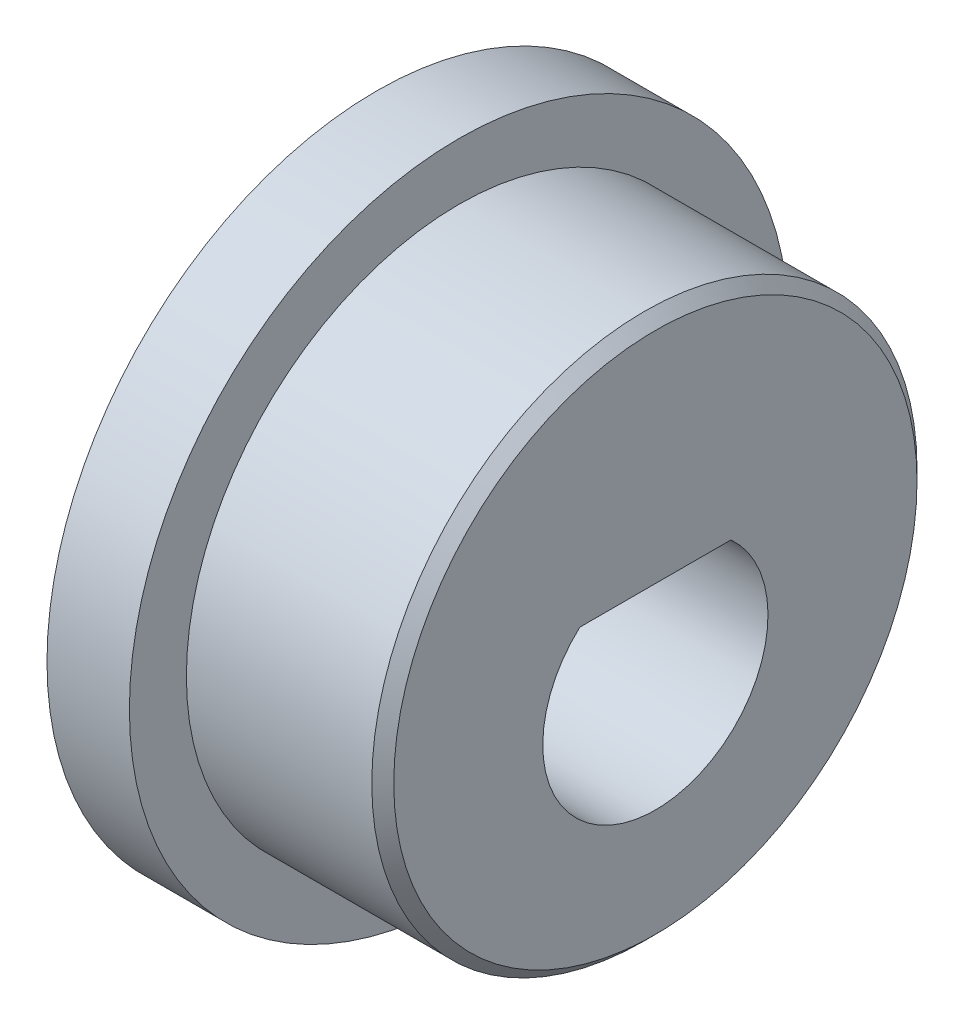
ISO-10303-21;
HEADER;
FILE_DESCRIPTION(('STEP AP214'),'2;1');
FILE_NAME('part.step','',(''),(''),'','','');
FILE_SCHEMA(('AUTOMOTIVE_DESIGN { 1 0 10303 214 1 1 1 1 }'));
ENDSEC;
DATA;
#1=APPLICATION_CONTEXT('core data for automotive mechanical design processes');
#2=APPLICATION_PROTOCOL_DEFINITION('international standard','automotive_design',2000,#1);
#3=PRODUCT_CONTEXT('',#1,'mechanical');
#4=PRODUCT('Part','Part','',(#3));
#5=PRODUCT_RELATED_PRODUCT_CATEGORY('part','',(#4));
#6=PRODUCT_DEFINITION_FORMATION('','',#4);
#7=PRODUCT_DEFINITION_CONTEXT('part definition',#1,'design');
#8=PRODUCT_DEFINITION('design','',#6,#7);
#9=PRODUCT_DEFINITION_SHAPE('','',#8);
#10=(LENGTH_UNIT() NAMED_UNIT(*) SI_UNIT(.MILLI.,.METRE.));
#11=(NAMED_UNIT(*) PLANE_ANGLE_UNIT() SI_UNIT($,.RADIAN.));
#12=(NAMED_UNIT(*) SI_UNIT($,.STERADIAN.) SOLID_ANGLE_UNIT());
#13=UNCERTAINTY_MEASURE_WITH_UNIT(LENGTH_MEASURE(1.E-05),#10,'distance_accuracy_value','');
#14=(GEOMETRIC_REPRESENTATION_CONTEXT(3) GLOBAL_UNCERTAINTY_ASSIGNED_CONTEXT((#13)) GLOBAL_UNIT_ASSIGNED_CONTEXT((#10,
#11,#12)) REPRESENTATION_CONTEXT('',''));
#15=CARTESIAN_POINT('',(0.,0.,0.));
#16=DIRECTION('',(0.,0.,1.));
#17=DIRECTION('',(1.,0.,0.));
#18=AXIS2_PLACEMENT_3D('',#15,#16,#17);
#19=CARTESIAN_POINT('',(7.15,1.5,0.));
#20=DIRECTION('',(-1.,0.,0.));
#21=DIRECTION('',(0.,0.,1.));
#22=AXIS2_PLACEMENT_3D('',#19,#20,#21);
#23=CYLINDRICAL_SURFACE('',#22,9.925);
#24=CARTESIAN_POINT('',(6.74999999999998,1.5,0.));
#25=DIRECTION('',(1.,0.,0.));
#26=DIRECTION('',(0.,0.,-1.));
#27=AXIS2_PLACEMENT_3D('',#24,#25,#26);
#28=CIRCLE('',#27,9.925);
#29=CARTESIAN_POINT('',(6.74999999999998,1.5,-9.925));
#30=VERTEX_POINT('',#29);
#31=EDGE_CURVE('E11',#30,#30,#28,.F.);
#32=ORIENTED_EDGE('',*,*,#31,.T.);
#33=EDGE_LOOP('',(#32));
#34=FACE_BOUND('',#33,.T.);
#35=CARTESIAN_POINT('',(0.,1.5,0.));
#36=DIRECTION('',(1.,0.,0.));
#37=DIRECTION('',(0.,0.,-1.));
#38=AXIS2_PLACEMENT_3D('',#35,#36,#37);
#39=CIRCLE('',#38,9.925);
#40=CARTESIAN_POINT('',(0.,1.5,-9.925));
#41=VERTEX_POINT('',#40);
#42=EDGE_CURVE('E93',#41,#41,#39,.T.);
#43=ORIENTED_EDGE('',*,*,#42,.T.);
#44=EDGE_LOOP('',(#43));
#45=FACE_BOUND('',#44,.T.);
#46=ADVANCED_FACE('F43',(#34,#45),#23,.T.);
#47=CARTESIAN_POINT('',(7.15,1.5,0.));
#48=DIRECTION('',(1.,0.,0.));
#49=DIRECTION('',(0.,0.,-1.));
#50=AXIS2_PLACEMENT_3D('',#47,#48,#49);
#51=PLANE('',#50);
#52=CARTESIAN_POINT('',(7.15,1.5,0.));
#53=DIRECTION('',(1.,0.,0.));
#54=DIRECTION('',(0.,0.,-1.));
#55=AXIS2_PLACEMENT_3D('',#52,#53,#54);
#56=CIRCLE('',#55,9.52499999999999);
#57=CARTESIAN_POINT('',(7.15,1.5,-9.52499999999999));
#58=VERTEX_POINT('',#57);
#59=EDGE_CURVE('E55',#58,#58,#56,.T.);
#60=ORIENTED_EDGE('',*,*,#59,.T.);
#61=EDGE_LOOP('',(#60));
#62=FACE_BOUND('',#61,.T.);
#63=CARTESIAN_POINT('',(7.15,0.,0.));
#64=DIRECTION('',(1.,0.,0.));
#65=DIRECTION('',(0.,0.,-1.));
#66=AXIS2_PLACEMENT_3D('',#63,#64,#65);
#67=CIRCLE('',#66,4.1);
#68=CARTESIAN_POINT('',(7.15,3.04097023990699,2.75));
#69=VERTEX_POINT('',#68);
#70=CARTESIAN_POINT('',(7.15,3.04097023990699,-2.75));
#71=VERTEX_POINT('',#70);
#72=EDGE_CURVE('E71',#69,#71,#67,.T.);
#73=ORIENTED_EDGE('',*,*,#72,.F.);
#74=DIRECTION('',(0.,0.,1.));
#75=VECTOR('',#74,1.);
#76=CARTESIAN_POINT('',(7.15,3.04097023990699,2.75));
#77=LINE('',#76,#75);
#78=EDGE_CURVE('E87',#71,#69,#77,.T.);
#79=ORIENTED_EDGE('',*,*,#78,.F.);
#80=EDGE_LOOP('',(#73,#79));
#81=FACE_BOUND('',#80,.T.);
#82=ADVANCED_FACE('F101',(#62,#81),#51,.T.);
#83=CARTESIAN_POINT('',(-3.,1.5,0.));
#84=DIRECTION('',(1.,0.,0.));
#85=DIRECTION('',(0.,0.,-1.));
#86=AXIS2_PLACEMENT_3D('',#83,#84,#85);
#87=CYLINDRICAL_SURFACE('',#86,12.);
#88=CARTESIAN_POINT('',(-3.,1.5,0.));
#89=DIRECTION('',(-1.,0.,0.));
#90=DIRECTION('',(0.,0.,1.));
#91=AXIS2_PLACEMENT_3D('',#88,#89,#90);
#92=CIRCLE('',#91,12.);
#93=CARTESIAN_POINT('',(-3.,1.5,12.));
#94=VERTEX_POINT('',#93);
#95=EDGE_CURVE('E86',#94,#94,#92,.T.);
#96=ORIENTED_EDGE('',*,*,#95,.F.);
#97=EDGE_LOOP('',(#96));
#98=FACE_BOUND('',#97,.T.);
#99=CARTESIAN_POINT('',(0.,1.5,0.));
#100=DIRECTION('',(-1.,0.,0.));
#101=DIRECTION('',(0.,0.,1.));
#102=AXIS2_PLACEMENT_3D('',#99,#100,#101);
#103=CIRCLE('',#102,12.);
#104=CARTESIAN_POINT('',(0.,1.5,12.));
#105=VERTEX_POINT('',#104);
#106=EDGE_CURVE('E95',#105,#105,#103,.T.);
#107=ORIENTED_EDGE('',*,*,#106,.T.);
#108=EDGE_LOOP('',(#107));
#109=FACE_BOUND('',#108,.T.);
#110=ADVANCED_FACE('F117',(#98,#109),#87,.T.);
#111=CARTESIAN_POINT('',(-3.,1.5,0.));
#112=DIRECTION('',(-1.,0.,0.));
#113=DIRECTION('',(0.,0.,1.));
#114=AXIS2_PLACEMENT_3D('',#111,#112,#113);
#115=PLANE('',#114);
#116=CARTESIAN_POINT('',(-3.,0.,0.));
#117=DIRECTION('',(1.,0.,0.));
#118=DIRECTION('',(0.,0.,-1.));
#119=AXIS2_PLACEMENT_3D('',#116,#117,#118);
#120=CIRCLE('',#119,4.1);
#121=CARTESIAN_POINT('',(-3.,3.04097023990699,2.75));
#122=VERTEX_POINT('',#121);
#123=CARTESIAN_POINT('',(-3.,3.04097023990699,-2.75));
#124=VERTEX_POINT('',#123);
#125=EDGE_CURVE('E70',#122,#124,#120,.T.);
#126=ORIENTED_EDGE('',*,*,#125,.T.);
#127=DIRECTION('',(0.,0.,1.));
#128=VECTOR('',#127,1.);
#129=CARTESIAN_POINT('',(-3.,3.04097023990699,2.75));
#130=LINE('',#129,#128);
#131=EDGE_CURVE('E77',#124,#122,#130,.T.);
#132=ORIENTED_EDGE('',*,*,#131,.T.);
#133=EDGE_LOOP('',(#126,#132));
#134=FACE_BOUND('',#133,.T.);
#135=ORIENTED_EDGE('',*,*,#95,.T.);
#136=EDGE_LOOP('',(#135));
#137=FACE_BOUND('',#136,.T.);
#138=ADVANCED_FACE('F85',(#134,#137),#115,.T.);
#139=CARTESIAN_POINT('',(0.,1.5,0.));
#140=DIRECTION('',(-1.,0.,0.));
#141=DIRECTION('',(0.,0.,1.));
#142=AXIS2_PLACEMENT_3D('',#139,#140,#141);
#143=PLANE('',#142);
#144=ORIENTED_EDGE('',*,*,#42,.F.);
#145=EDGE_LOOP('',(#144));
#146=FACE_BOUND('',#145,.T.);
#147=ORIENTED_EDGE('',*,*,#106,.F.);
#148=EDGE_LOOP('',(#147));
#149=FACE_BOUND('',#148,.T.);
#150=ADVANCED_FACE('F124',(#146,#149),#143,.F.);
#151=CARTESIAN_POINT('',(-3.,0.,0.));
#152=DIRECTION('',(1.,0.,0.));
#153=DIRECTION('',(0.,0.,-1.));
#154=AXIS2_PLACEMENT_3D('',#151,#152,#153);
#155=CYLINDRICAL_SURFACE('',#154,4.1);
#156=ORIENTED_EDGE('',*,*,#72,.T.);
#157=DIRECTION('',(1.,0.,0.));
#158=VECTOR('',#157,1.);
#159=CARTESIAN_POINT('',(-3.,3.04097023990699,-2.75));
#160=LINE('',#159,#158);
#161=EDGE_CURVE('E56',#124,#71,#160,.T.);
#162=ORIENTED_EDGE('',*,*,#161,.F.);
#163=ORIENTED_EDGE('',*,*,#125,.F.);
#164=DIRECTION('',(1.,0.,0.));
#165=VECTOR('',#164,1.);
#166=CARTESIAN_POINT('',(-3.,3.04097023990699,2.75));
#167=LINE('',#166,#165);
#168=EDGE_CURVE('E73',#122,#69,#167,.T.);
#169=ORIENTED_EDGE('',*,*,#168,.T.);
#170=EDGE_LOOP('',(#156,#162,#163,#169));
#171=FACE_BOUND('',#170,.T.);
#172=ADVANCED_FACE('F72',(#171),#155,.F.);
#173=CARTESIAN_POINT('',(-3.,3.04097023990699,2.75));
#174=DIRECTION('',(0.,1.,0.));
#175=DIRECTION('',(0.,0.,1.));
#176=AXIS2_PLACEMENT_3D('',#173,#174,#175);
#177=PLANE('',#176);
#178=ORIENTED_EDGE('',*,*,#78,.T.);
#179=ORIENTED_EDGE('',*,*,#168,.F.);
#180=ORIENTED_EDGE('',*,*,#131,.F.);
#181=ORIENTED_EDGE('',*,*,#161,.T.);
#182=EDGE_LOOP('',(#178,#179,#180,#181));
#183=FACE_BOUND('',#182,.T.);
#184=ADVANCED_FACE('F79',(#183),#177,.F.);
#185=CARTESIAN_POINT('',(7.15,1.5,0.));
#186=DIRECTION('',(-1.,0.,0.));
#187=DIRECTION('',(0.,0.,1.));
#188=AXIS2_PLACEMENT_3D('',#185,#186,#187);
#189=CONICAL_SURFACE('',#188,9.52499999999999,0.785398163397446);
#190=ORIENTED_EDGE('',*,*,#31,.F.);
#191=EDGE_LOOP('',(#190));
#192=FACE_BOUND('',#191,.T.);
#193=ORIENTED_EDGE('',*,*,#59,.F.);
#194=EDGE_LOOP('',(#193));
#195=FACE_BOUND('',#194,.T.);
#196=ADVANCED_FACE('F46',(#192,#195),#189,.T.);
#197=CLOSED_SHELL('',(#46,#82,#110,#138,#150,#172,#184,#196));
#198=MANIFOLD_SOLID_BREP('B2',#197);
#199=ADVANCED_BREP_SHAPE_REPRESENTATION('',(#18,#198),#14);
#200=SHAPE_DEFINITION_REPRESENTATION(#9,#199);
ENDSEC;
END-ISO-10303-21;
